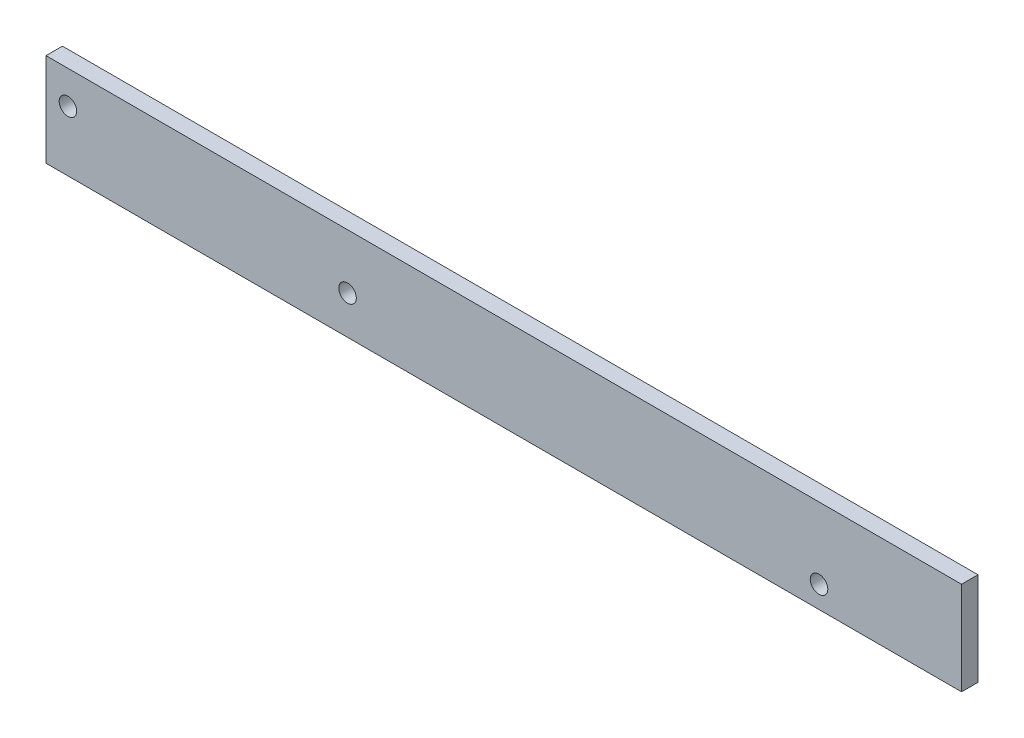
ISO-10303-21;
HEADER;
FILE_DESCRIPTION(('STEP AP214'),'2;1');
FILE_NAME('part.step','',(''),(''),'','','');
FILE_SCHEMA(('AUTOMOTIVE_DESIGN { 1 0 10303 214 1 1 1 1 }'));
ENDSEC;
DATA;
#1=APPLICATION_CONTEXT('core data for automotive mechanical design processes');
#2=APPLICATION_PROTOCOL_DEFINITION('international standard','automotive_design',2000,#1);
#3=PRODUCT_CONTEXT('',#1,'mechanical');
#4=PRODUCT('Part','Part','',(#3));
#5=PRODUCT_RELATED_PRODUCT_CATEGORY('part','',(#4));
#6=PRODUCT_DEFINITION_FORMATION('','',#4);
#7=PRODUCT_DEFINITION_CONTEXT('part definition',#1,'design');
#8=PRODUCT_DEFINITION('design','',#6,#7);
#9=PRODUCT_DEFINITION_SHAPE('','',#8);
#10=(LENGTH_UNIT() NAMED_UNIT(*) SI_UNIT(.MILLI.,.METRE.));
#11=(NAMED_UNIT(*) PLANE_ANGLE_UNIT() SI_UNIT($,.RADIAN.));
#12=(NAMED_UNIT(*) SI_UNIT($,.STERADIAN.) SOLID_ANGLE_UNIT());
#13=UNCERTAINTY_MEASURE_WITH_UNIT(LENGTH_MEASURE(1.E-05),#10,'distance_accuracy_value','');
#14=(GEOMETRIC_REPRESENTATION_CONTEXT(3) GLOBAL_UNCERTAINTY_ASSIGNED_CONTEXT((#13)) GLOBAL_UNIT_ASSIGNED_CONTEXT((#10,
#11,#12)) REPRESENTATION_CONTEXT('',''));
#15=CARTESIAN_POINT('',(0.,0.,0.));
#16=DIRECTION('',(0.,0.,1.));
#17=DIRECTION('',(1.,0.,0.));
#18=AXIS2_PLACEMENT_3D('',#15,#16,#17);
#19=CARTESIAN_POINT('',(-65.5000000000001,-8.50000000000001,3.));
#20=DIRECTION('',(1.,0.,0.));
#21=DIRECTION('',(0.,0.,-1.));
#22=AXIS2_PLACEMENT_3D('',#19,#20,#21);
#23=PLANE('',#22);
#24=DIRECTION('',(0.,-1.,0.));
#25=VECTOR('',#24,1.);
#26=CARTESIAN_POINT('',(-65.5000000000001,-8.50000000000001,0.));
#27=LINE('',#26,#25);
#28=CARTESIAN_POINT('',(-65.5000000000001,8.49999999999999,0.));
#29=VERTEX_POINT('',#28);
#30=CARTESIAN_POINT('',(-65.5000000000001,-8.50000000000001,0.));
#31=VERTEX_POINT('',#30);
#32=EDGE_CURVE('E96',#29,#31,#27,.T.);
#33=ORIENTED_EDGE('',*,*,#32,.T.);
#34=DIRECTION('',(0.,0.,-1.));
#35=VECTOR('',#34,1.);
#36=CARTESIAN_POINT('',(-65.5000000000001,-8.50000000000001,3.));
#37=LINE('',#36,#35);
#38=CARTESIAN_POINT('',(-65.5000000000001,-8.50000000000001,3.));
#39=VERTEX_POINT('',#38);
#40=EDGE_CURVE('E11',#39,#31,#37,.T.);
#41=ORIENTED_EDGE('',*,*,#40,.F.);
#42=DIRECTION('',(0.,-1.,0.));
#43=VECTOR('',#42,1.);
#44=CARTESIAN_POINT('',(-65.5000000000001,-8.50000000000001,3.));
#45=LINE('',#44,#43);
#46=CARTESIAN_POINT('',(-65.5000000000001,8.49999999999999,3.));
#47=VERTEX_POINT('',#46);
#48=EDGE_CURVE('E84',#47,#39,#45,.T.);
#49=ORIENTED_EDGE('',*,*,#48,.F.);
#50=DIRECTION('',(0.,0.,-1.));
#51=VECTOR('',#50,1.);
#52=CARTESIAN_POINT('',(-65.5000000000001,8.49999999999999,3.));
#53=LINE('',#52,#51);
#54=EDGE_CURVE('E92',#47,#29,#53,.T.);
#55=ORIENTED_EDGE('',*,*,#54,.T.);
#56=EDGE_LOOP('',(#33,#41,#49,#55));
#57=FACE_BOUND('',#56,.T.);
#58=ADVANCED_FACE('F33',(#57),#23,.F.);
#59=CARTESIAN_POINT('',(101.5,-8.49999999999999,3.));
#60=DIRECTION('',(0.,1.,0.));
#61=DIRECTION('',(-1.,0.,0.));
#62=AXIS2_PLACEMENT_3D('',#59,#60,#61);
#63=PLANE('',#62);
#64=DIRECTION('',(1.,0.,0.));
#65=VECTOR('',#64,1.);
#66=CARTESIAN_POINT('',(101.5,-8.49999999999999,0.));
#67=LINE('',#66,#65);
#68=CARTESIAN_POINT('',(101.5,-8.49999999999999,0.));
#69=VERTEX_POINT('',#68);
#70=EDGE_CURVE('E88',#31,#69,#67,.T.);
#71=ORIENTED_EDGE('',*,*,#70,.T.);
#72=DIRECTION('',(0.,0.,-1.));
#73=VECTOR('',#72,1.);
#74=CARTESIAN_POINT('',(101.5,-8.49999999999999,3.));
#75=LINE('',#74,#73);
#76=CARTESIAN_POINT('',(101.5,-8.49999999999999,3.));
#77=VERTEX_POINT('',#76);
#78=EDGE_CURVE('E41',#77,#69,#75,.T.);
#79=ORIENTED_EDGE('',*,*,#78,.F.);
#80=DIRECTION('',(1.,0.,0.));
#81=VECTOR('',#80,1.);
#82=CARTESIAN_POINT('',(101.5,-8.49999999999999,3.));
#83=LINE('',#82,#81);
#84=EDGE_CURVE('E79',#39,#77,#83,.T.);
#85=ORIENTED_EDGE('',*,*,#84,.F.);
#86=ORIENTED_EDGE('',*,*,#40,.T.);
#87=EDGE_LOOP('',(#71,#79,#85,#86));
#88=FACE_BOUND('',#87,.T.);
#89=ADVANCED_FACE('F87',(#88),#63,.F.);
#90=CARTESIAN_POINT('',(101.5,-8.49999999999999,3.));
#91=DIRECTION('',(-1.,0.,0.));
#92=DIRECTION('',(0.,0.,1.));
#93=AXIS2_PLACEMENT_3D('',#90,#91,#92);
#94=PLANE('',#93);
#95=DIRECTION('',(0.,1.,0.));
#96=VECTOR('',#95,1.);
#97=CARTESIAN_POINT('',(101.5,-8.49999999999999,0.));
#98=LINE('',#97,#96);
#99=CARTESIAN_POINT('',(101.5,8.50000000000001,0.));
#100=VERTEX_POINT('',#99);
#101=EDGE_CURVE('E66',#69,#100,#98,.T.);
#102=ORIENTED_EDGE('',*,*,#101,.T.);
#103=DIRECTION('',(0.,0.,-1.));
#104=VECTOR('',#103,1.);
#105=CARTESIAN_POINT('',(101.5,8.50000000000001,3.));
#106=LINE('',#105,#104);
#107=CARTESIAN_POINT('',(101.5,8.50000000000001,3.));
#108=VERTEX_POINT('',#107);
#109=EDGE_CURVE('E89',#108,#100,#106,.T.);
#110=ORIENTED_EDGE('',*,*,#109,.F.);
#111=DIRECTION('',(0.,1.,0.));
#112=VECTOR('',#111,1.);
#113=CARTESIAN_POINT('',(101.5,-8.49999999999999,3.));
#114=LINE('',#113,#112);
#115=EDGE_CURVE('E82',#77,#108,#114,.T.);
#116=ORIENTED_EDGE('',*,*,#115,.F.);
#117=ORIENTED_EDGE('',*,*,#78,.T.);
#118=EDGE_LOOP('',(#102,#110,#116,#117));
#119=FACE_BOUND('',#118,.T.);
#120=ADVANCED_FACE('F90',(#119),#94,.F.);
#121=CARTESIAN_POINT('',(101.5,8.50000000000001,3.));
#122=DIRECTION('',(0.,-1.,0.));
#123=DIRECTION('',(1.,0.,0.));
#124=AXIS2_PLACEMENT_3D('',#121,#122,#123);
#125=PLANE('',#124);
#126=DIRECTION('',(-1.,0.,0.));
#127=VECTOR('',#126,1.);
#128=CARTESIAN_POINT('',(101.5,8.50000000000001,0.));
#129=LINE('',#128,#127);
#130=EDGE_CURVE('E72',#100,#29,#129,.T.);
#131=ORIENTED_EDGE('',*,*,#130,.T.);
#132=ORIENTED_EDGE('',*,*,#54,.F.);
#133=DIRECTION('',(-1.,0.,0.));
#134=VECTOR('',#133,1.);
#135=CARTESIAN_POINT('',(101.5,8.50000000000001,3.));
#136=LINE('',#135,#134);
#137=EDGE_CURVE('E49',#108,#47,#136,.T.);
#138=ORIENTED_EDGE('',*,*,#137,.F.);
#139=ORIENTED_EDGE('',*,*,#109,.T.);
#140=EDGE_LOOP('',(#131,#132,#138,#139));
#141=FACE_BOUND('',#140,.T.);
#142=ADVANCED_FACE('F104',(#141),#125,.F.);
#143=CARTESIAN_POINT('',(0.,0.,3.));
#144=DIRECTION('',(0.,0.,1.));
#145=DIRECTION('',(1.,0.,0.));
#146=AXIS2_PLACEMENT_3D('',#143,#144,#145);
#147=PLANE('',#146);
#148=CARTESIAN_POINT('',(-10.5000000000001,-1.50000000000009,3.));
#149=DIRECTION('',(0.,0.,1.));
#150=DIRECTION('',(1.,0.,0.));
#151=AXIS2_PLACEMENT_3D('',#148,#149,#150);
#152=CIRCLE('',#151,1.59999999999977);
#153=CARTESIAN_POINT('',(-8.90000000000033,-1.50000000000009,3.));
#154=VERTEX_POINT('',#153);
#155=EDGE_CURVE('E122',#154,#154,#152,.T.);
#156=ORIENTED_EDGE('',*,*,#155,.F.);
#157=EDGE_LOOP('',(#156));
#158=FACE_BOUND('',#157,.T.);
#159=CARTESIAN_POINT('',(75.4999999999999,-4.50000000000012,3.));
#160=DIRECTION('',(0.,0.,-1.));
#161=DIRECTION('',(-1.,0.,0.));
#162=AXIS2_PLACEMENT_3D('',#159,#160,#161);
#163=CIRCLE('',#162,1.60000000000001);
#164=CARTESIAN_POINT('',(73.8999999999999,-4.50000000000012,3.));
#165=VERTEX_POINT('',#164);
#166=EDGE_CURVE('E113',#165,#165,#163,.T.);
#167=ORIENTED_EDGE('',*,*,#166,.T.);
#168=EDGE_LOOP('',(#167));
#169=FACE_BOUND('',#168,.T.);
#170=CARTESIAN_POINT('',(-61.5000000000002,2.49999999999998,3.));
#171=DIRECTION('',(0.,0.,1.));
#172=DIRECTION('',(1.,0.,0.));
#173=AXIS2_PLACEMENT_3D('',#170,#171,#172);
#174=CIRCLE('',#173,1.59999999999999);
#175=CARTESIAN_POINT('',(-59.9000000000002,2.49999999999998,3.));
#176=VERTEX_POINT('',#175);
#177=EDGE_CURVE('E110',#176,#176,#174,.T.);
#178=ORIENTED_EDGE('',*,*,#177,.F.);
#179=EDGE_LOOP('',(#178));
#180=FACE_BOUND('',#179,.T.);
#181=ORIENTED_EDGE('',*,*,#48,.T.);
#182=ORIENTED_EDGE('',*,*,#84,.T.);
#183=ORIENTED_EDGE('',*,*,#115,.T.);
#184=ORIENTED_EDGE('',*,*,#137,.T.);
#185=EDGE_LOOP('',(#181,#182,#183,#184));
#186=FACE_BOUND('',#185,.T.);
#187=ADVANCED_FACE('F80',(#158,#169,#180,#186),#147,.T.);
#188=CARTESIAN_POINT('',(0.,0.,0.));
#189=DIRECTION('',(0.,0.,1.));
#190=DIRECTION('',(1.,0.,0.));
#191=AXIS2_PLACEMENT_3D('',#188,#189,#190);
#192=PLANE('',#191);
#193=CARTESIAN_POINT('',(-10.5000000000001,-1.50000000000009,0.));
#194=DIRECTION('',(0.,0.,1.));
#195=DIRECTION('',(1.,0.,0.));
#196=AXIS2_PLACEMENT_3D('',#193,#194,#195);
#197=CIRCLE('',#196,1.59999999999977);
#198=CARTESIAN_POINT('',(-8.90000000000033,-1.50000000000009,0.));
#199=VERTEX_POINT('',#198);
#200=EDGE_CURVE('E119',#199,#199,#197,.T.);
#201=ORIENTED_EDGE('',*,*,#200,.T.);
#202=EDGE_LOOP('',(#201));
#203=FACE_BOUND('',#202,.T.);
#204=CARTESIAN_POINT('',(75.4999999999999,-4.50000000000012,0.));
#205=DIRECTION('',(0.,0.,-1.));
#206=DIRECTION('',(-1.,0.,0.));
#207=AXIS2_PLACEMENT_3D('',#204,#205,#206);
#208=CIRCLE('',#207,1.60000000000001);
#209=CARTESIAN_POINT('',(73.8999999999999,-4.50000000000012,0.));
#210=VERTEX_POINT('',#209);
#211=EDGE_CURVE('E116',#210,#210,#208,.T.);
#212=ORIENTED_EDGE('',*,*,#211,.F.);
#213=EDGE_LOOP('',(#212));
#214=FACE_BOUND('',#213,.T.);
#215=CARTESIAN_POINT('',(-61.5000000000002,2.49999999999998,0.));
#216=DIRECTION('',(0.,0.,1.));
#217=DIRECTION('',(1.,0.,0.));
#218=AXIS2_PLACEMENT_3D('',#215,#216,#217);
#219=CIRCLE('',#218,1.59999999999999);
#220=CARTESIAN_POINT('',(-59.9000000000002,2.49999999999998,0.));
#221=VERTEX_POINT('',#220);
#222=EDGE_CURVE('E99',#221,#221,#219,.T.);
#223=ORIENTED_EDGE('',*,*,#222,.T.);
#224=EDGE_LOOP('',(#223));
#225=FACE_BOUND('',#224,.T.);
#226=ORIENTED_EDGE('',*,*,#32,.F.);
#227=ORIENTED_EDGE('',*,*,#130,.F.);
#228=ORIENTED_EDGE('',*,*,#101,.F.);
#229=ORIENTED_EDGE('',*,*,#70,.F.);
#230=EDGE_LOOP('',(#226,#227,#228,#229));
#231=FACE_BOUND('',#230,.T.);
#232=ADVANCED_FACE('F107',(#203,#214,#225,#231),#192,.F.);
#233=CARTESIAN_POINT('',(-61.5000000000002,2.49999999999998,0.));
#234=DIRECTION('',(0.,0.,1.));
#235=DIRECTION('',(1.,0.,0.));
#236=AXIS2_PLACEMENT_3D('',#233,#234,#235);
#237=CYLINDRICAL_SURFACE('',#236,1.59999999999999);
#238=ORIENTED_EDGE('',*,*,#222,.F.);
#239=EDGE_LOOP('',(#238));
#240=FACE_BOUND('',#239,.T.);
#241=ORIENTED_EDGE('',*,*,#177,.T.);
#242=EDGE_LOOP('',(#241));
#243=FACE_BOUND('',#242,.T.);
#244=ADVANCED_FACE('F144',(#240,#243),#237,.F.);
#245=CARTESIAN_POINT('',(75.4999999999999,-4.50000000000012,3.));
#246=DIRECTION('',(0.,0.,-1.));
#247=DIRECTION('',(-1.,0.,0.));
#248=AXIS2_PLACEMENT_3D('',#245,#246,#247);
#249=CYLINDRICAL_SURFACE('',#248,1.60000000000001);
#250=ORIENTED_EDGE('',*,*,#166,.F.);
#251=EDGE_LOOP('',(#250));
#252=FACE_BOUND('',#251,.T.);
#253=ORIENTED_EDGE('',*,*,#211,.T.);
#254=EDGE_LOOP('',(#253));
#255=FACE_BOUND('',#254,.T.);
#256=ADVANCED_FACE('F133',(#252,#255),#249,.F.);
#257=CARTESIAN_POINT('',(-10.5000000000001,-1.50000000000009,0.));
#258=DIRECTION('',(0.,0.,1.));
#259=DIRECTION('',(1.,0.,0.));
#260=AXIS2_PLACEMENT_3D('',#257,#258,#259);
#261=CYLINDRICAL_SURFACE('',#260,1.59999999999977);
#262=ORIENTED_EDGE('',*,*,#200,.F.);
#263=EDGE_LOOP('',(#262));
#264=FACE_BOUND('',#263,.T.);
#265=ORIENTED_EDGE('',*,*,#155,.T.);
#266=EDGE_LOOP('',(#265));
#267=FACE_BOUND('',#266,.T.);
#268=ADVANCED_FACE('F130',(#264,#267),#261,.F.);
#269=CLOSED_SHELL('',(#58,#89,#120,#142,#187,#232,#244,#256,#268));
#270=MANIFOLD_SOLID_BREP('B2',#269);
#271=ADVANCED_BREP_SHAPE_REPRESENTATION('',(#18,#270),#14);
#272=SHAPE_DEFINITION_REPRESENTATION(#9,#271);
ENDSEC;
END-ISO-10303-21;
